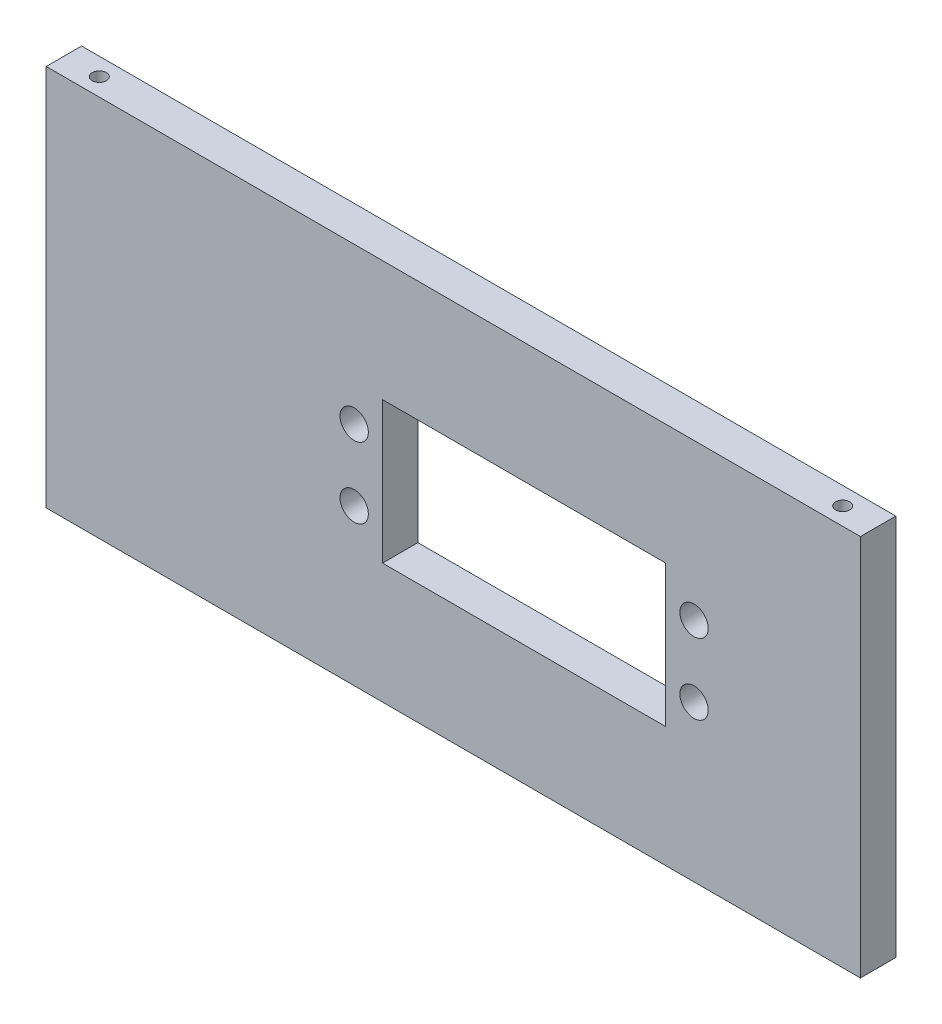
ISO-10303-21;
HEADER;
FILE_DESCRIPTION(('STEP AP214'),'2;1');
FILE_NAME('part.step','',(''),(''),'','','');
FILE_SCHEMA(('AUTOMOTIVE_DESIGN { 1 0 10303 214 1 1 1 1 }'));
ENDSEC;
DATA;
#1=APPLICATION_CONTEXT('core data for automotive mechanical design processes');
#2=APPLICATION_PROTOCOL_DEFINITION('international standard','automotive_design',2000,#1);
#3=PRODUCT_CONTEXT('',#1,'mechanical');
#4=PRODUCT('Part','Part','',(#3));
#5=PRODUCT_RELATED_PRODUCT_CATEGORY('part','',(#4));
#6=PRODUCT_DEFINITION_FORMATION('','',#4);
#7=PRODUCT_DEFINITION_CONTEXT('part definition',#1,'design');
#8=PRODUCT_DEFINITION('design','',#6,#7);
#9=PRODUCT_DEFINITION_SHAPE('','',#8);
#10=(LENGTH_UNIT() NAMED_UNIT(*) SI_UNIT(.MILLI.,.METRE.));
#11=(NAMED_UNIT(*) PLANE_ANGLE_UNIT() SI_UNIT($,.RADIAN.));
#12=(NAMED_UNIT(*) SI_UNIT($,.STERADIAN.) SOLID_ANGLE_UNIT());
#13=UNCERTAINTY_MEASURE_WITH_UNIT(LENGTH_MEASURE(1.E-05),#10,'distance_accuracy_value','');
#14=(GEOMETRIC_REPRESENTATION_CONTEXT(3) GLOBAL_UNCERTAINTY_ASSIGNED_CONTEXT((#13)) GLOBAL_UNIT_ASSIGNED_CONTEXT((#10,
#11,#12)) REPRESENTATION_CONTEXT('',''));
#15=CARTESIAN_POINT('',(0.,0.,0.));
#16=DIRECTION('',(0.,0.,1.));
#17=DIRECTION('',(1.,0.,0.));
#18=AXIS2_PLACEMENT_3D('',#15,#16,#17);
#19=CARTESIAN_POINT('',(0.,0.,5.));
#20=DIRECTION('',(0.,0.,1.));
#21=DIRECTION('',(1.,0.,0.));
#22=AXIS2_PLACEMENT_3D('',#19,#20,#21);
#23=PLANE('',#22);
#24=DIRECTION('',(1.,0.,0.));
#25=VECTOR('',#24,1.);
#26=CARTESIAN_POINT('',(3.06248058403234,-13.4840994339615,5.));
#27=LINE('',#26,#25);
#28=CARTESIAN_POINT('',(3.06248058403234,-13.4840994339615,5.));
#29=VERTEX_POINT('',#28);
#30=CARTESIAN_POINT('',(43.0624805840323,-13.4840994339615,5.));
#31=VERTEX_POINT('',#30);
#32=EDGE_CURVE('E191',#29,#31,#27,.T.);
#33=ORIENTED_EDGE('',*,*,#32,.F.);
#34=DIRECTION('',(0.,-1.,0.));
#35=VECTOR('',#34,1.);
#36=CARTESIAN_POINT('',(3.06248058403234,6.51590056603846,5.));
#37=LINE('',#36,#35);
#38=CARTESIAN_POINT('',(3.06248058403234,6.51590056603846,5.));
#39=VERTEX_POINT('',#38);
#40=EDGE_CURVE('E182',#39,#29,#37,.T.);
#41=ORIENTED_EDGE('',*,*,#40,.F.);
#42=DIRECTION('',(1.,0.,0.));
#43=VECTOR('',#42,1.);
#44=CARTESIAN_POINT('',(3.06248058403234,6.51590056603846,5.));
#45=LINE('',#44,#43);
#46=CARTESIAN_POINT('',(43.0624805840323,6.51590056603846,5.));
#47=VERTEX_POINT('',#46);
#48=EDGE_CURVE('E203',#39,#47,#45,.T.);
#49=ORIENTED_EDGE('',*,*,#48,.T.);
#50=DIRECTION('',(0.,-1.,0.));
#51=VECTOR('',#50,1.);
#52=CARTESIAN_POINT('',(43.0624805840323,6.51590056603846,5.));
#53=LINE('',#52,#51);
#54=EDGE_CURVE('E132',#47,#31,#53,.T.);
#55=ORIENTED_EDGE('',*,*,#54,.T.);
#56=EDGE_LOOP('',(#33,#41,#49,#55));
#57=FACE_BOUND('',#56,.T.);
#58=CARTESIAN_POINT('',(-0.937519415967665,-8.48409943396155,5.));
#59=DIRECTION('',(0.,0.,1.));
#60=DIRECTION('',(1.,0.,0.));
#61=AXIS2_PLACEMENT_3D('',#58,#59,#60);
#62=CIRCLE('',#61,2.);
#63=CARTESIAN_POINT('',(1.06248058403234,-8.48409943396155,5.));
#64=VERTEX_POINT('',#63);
#65=EDGE_CURVE('E220',#64,#64,#62,.T.);
#66=ORIENTED_EDGE('',*,*,#65,.F.);
#67=EDGE_LOOP('',(#66));
#68=FACE_BOUND('',#67,.T.);
#69=CARTESIAN_POINT('',(-0.937519415967661,1.51590056603845,5.));
#70=DIRECTION('',(0.,0.,1.));
#71=DIRECTION('',(1.,0.,0.));
#72=AXIS2_PLACEMENT_3D('',#69,#70,#71);
#73=CIRCLE('',#72,2.);
#74=CARTESIAN_POINT('',(1.06248058403234,1.51590056603845,5.));
#75=VERTEX_POINT('',#74);
#76=EDGE_CURVE('E232',#75,#75,#73,.T.);
#77=ORIENTED_EDGE('',*,*,#76,.F.);
#78=EDGE_LOOP('',(#77));
#79=FACE_BOUND('',#78,.T.);
#80=DIRECTION('',(0.,-1.,0.));
#81=VECTOR('',#80,1.);
#82=CARTESIAN_POINT('',(-44.4375194159677,23.5159005660385,5.));
#83=LINE('',#82,#81);
#84=CARTESIAN_POINT('',(-44.4375194159677,23.5159005660385,5.));
#85=VERTEX_POINT('',#84);
#86=CARTESIAN_POINT('',(-44.4375194159677,-30.4840994339615,5.));
#87=VERTEX_POINT('',#86);
#88=EDGE_CURVE('E238',#85,#87,#83,.T.);
#89=ORIENTED_EDGE('',*,*,#88,.T.);
#90=DIRECTION('',(1.,0.,0.));
#91=VECTOR('',#90,1.);
#92=CARTESIAN_POINT('',(-44.4375194159677,-30.4840994339615,5.));
#93=LINE('',#92,#91);
#94=CARTESIAN_POINT('',(70.5624805840323,-30.4840994339615,5.));
#95=VERTEX_POINT('',#94);
#96=EDGE_CURVE('E241',#87,#95,#93,.T.);
#97=ORIENTED_EDGE('',*,*,#96,.T.);
#98=DIRECTION('',(0.,-1.,0.));
#99=VECTOR('',#98,1.);
#100=CARTESIAN_POINT('',(70.5624805840323,23.5159005660385,5.));
#101=LINE('',#100,#99);
#102=CARTESIAN_POINT('',(70.5624805840323,23.5159005660385,5.));
#103=VERTEX_POINT('',#102);
#104=EDGE_CURVE('E244',#103,#95,#101,.T.);
#105=ORIENTED_EDGE('',*,*,#104,.F.);
#106=DIRECTION('',(1.,0.,0.));
#107=VECTOR('',#106,1.);
#108=CARTESIAN_POINT('',(-44.4375194159677,23.5159005660385,5.));
#109=LINE('',#108,#107);
#110=EDGE_CURVE('E247',#85,#103,#109,.T.);
#111=ORIENTED_EDGE('',*,*,#110,.F.);
#112=EDGE_LOOP('',(#89,#97,#105,#111));
#113=FACE_BOUND('',#112,.T.);
#114=CARTESIAN_POINT('',(47.0624805840323,-8.48409943396155,5.));
#115=DIRECTION('',(0.,0.,1.));
#116=DIRECTION('',(1.,0.,0.));
#117=AXIS2_PLACEMENT_3D('',#114,#115,#116);
#118=CIRCLE('',#117,2.);
#119=CARTESIAN_POINT('',(49.0624805840323,-8.48409943396155,5.));
#120=VERTEX_POINT('',#119);
#121=EDGE_CURVE('E226',#120,#120,#118,.T.);
#122=ORIENTED_EDGE('',*,*,#121,.F.);
#123=EDGE_LOOP('',(#122));
#124=FACE_BOUND('',#123,.T.);
#125=CARTESIAN_POINT('',(47.0624805840323,1.51590056603845,5.));
#126=DIRECTION('',(0.,0.,1.));
#127=DIRECTION('',(1.,0.,0.));
#128=AXIS2_PLACEMENT_3D('',#125,#126,#127);
#129=CIRCLE('',#128,2.);
#130=CARTESIAN_POINT('',(49.0624805840323,1.51590056603845,5.));
#131=VERTEX_POINT('',#130);
#132=EDGE_CURVE('E209',#131,#131,#129,.T.);
#133=ORIENTED_EDGE('',*,*,#132,.F.);
#134=EDGE_LOOP('',(#133));
#135=FACE_BOUND('',#134,.T.);
#136=ADVANCED_FACE('F117',(#57,#68,#79,#113,#124,#135),#23,.T.);
#137=CARTESIAN_POINT('',(0.,0.,0.));
#138=DIRECTION('',(0.,0.,1.));
#139=DIRECTION('',(1.,0.,0.));
#140=AXIS2_PLACEMENT_3D('',#137,#138,#139);
#141=PLANE('',#140);
#142=CARTESIAN_POINT('',(-0.937519415967665,-8.48409943396155,0.));
#143=DIRECTION('',(0.,0.,1.));
#144=DIRECTION('',(1.,0.,0.));
#145=AXIS2_PLACEMENT_3D('',#142,#143,#144);
#146=CIRCLE('',#145,2.);
#147=CARTESIAN_POINT('',(1.06248058403234,-8.48409943396155,0.));
#148=VERTEX_POINT('',#147);
#149=EDGE_CURVE('E198',#148,#148,#146,.T.);
#150=ORIENTED_EDGE('',*,*,#149,.T.);
#151=EDGE_LOOP('',(#150));
#152=FACE_BOUND('',#151,.T.);
#153=CARTESIAN_POINT('',(47.0624805840323,-8.48409943396155,0.));
#154=DIRECTION('',(0.,0.,1.));
#155=DIRECTION('',(1.,0.,0.));
#156=AXIS2_PLACEMENT_3D('',#153,#154,#155);
#157=CIRCLE('',#156,2.);
#158=CARTESIAN_POINT('',(49.0624805840323,-8.48409943396155,0.));
#159=VERTEX_POINT('',#158);
#160=EDGE_CURVE('E223',#159,#159,#157,.T.);
#161=ORIENTED_EDGE('',*,*,#160,.T.);
#162=EDGE_LOOP('',(#161));
#163=FACE_BOUND('',#162,.T.);
#164=CARTESIAN_POINT('',(-0.937519415967661,1.51590056603845,0.));
#165=DIRECTION('',(0.,0.,1.));
#166=DIRECTION('',(1.,0.,0.));
#167=AXIS2_PLACEMENT_3D('',#164,#165,#166);
#168=CIRCLE('',#167,2.);
#169=CARTESIAN_POINT('',(1.06248058403234,1.51590056603845,0.));
#170=VERTEX_POINT('',#169);
#171=EDGE_CURVE('E229',#170,#170,#168,.T.);
#172=ORIENTED_EDGE('',*,*,#171,.T.);
#173=EDGE_LOOP('',(#172));
#174=FACE_BOUND('',#173,.T.);
#175=DIRECTION('',(0.,-1.,0.));
#176=VECTOR('',#175,1.);
#177=CARTESIAN_POINT('',(-44.4375194159677,23.5159005660385,0.));
#178=LINE('',#177,#176);
#179=CARTESIAN_POINT('',(-44.4375194159677,23.5159005660385,0.));
#180=VERTEX_POINT('',#179);
#181=CARTESIAN_POINT('',(-44.4375194159677,-30.4840994339615,0.));
#182=VERTEX_POINT('',#181);
#183=EDGE_CURVE('E235',#180,#182,#178,.T.);
#184=ORIENTED_EDGE('',*,*,#183,.F.);
#185=DIRECTION('',(1.,0.,0.));
#186=VECTOR('',#185,1.);
#187=CARTESIAN_POINT('',(-44.4375194159677,23.5159005660385,0.));
#188=LINE('',#187,#186);
#189=CARTESIAN_POINT('',(70.5624805840323,23.5159005660385,0.));
#190=VERTEX_POINT('',#189);
#191=EDGE_CURVE('E242',#180,#190,#188,.T.);
#192=ORIENTED_EDGE('',*,*,#191,.T.);
#193=DIRECTION('',(0.,-1.,0.));
#194=VECTOR('',#193,1.);
#195=CARTESIAN_POINT('',(70.5624805840323,23.5159005660385,0.));
#196=LINE('',#195,#194);
#197=CARTESIAN_POINT('',(70.5624805840323,-30.4840994339615,0.));
#198=VERTEX_POINT('',#197);
#199=EDGE_CURVE('E256',#190,#198,#196,.T.);
#200=ORIENTED_EDGE('',*,*,#199,.T.);
#201=DIRECTION('',(1.,0.,0.));
#202=VECTOR('',#201,1.);
#203=CARTESIAN_POINT('',(-44.4375194159677,-30.4840994339615,0.));
#204=LINE('',#203,#202);
#205=EDGE_CURVE('E253',#182,#198,#204,.T.);
#206=ORIENTED_EDGE('',*,*,#205,.F.);
#207=EDGE_LOOP('',(#184,#192,#200,#206));
#208=FACE_BOUND('',#207,.T.);
#209=DIRECTION('',(0.,-1.,0.));
#210=VECTOR('',#209,1.);
#211=CARTESIAN_POINT('',(3.06248058403234,6.51590056603846,0.));
#212=LINE('',#211,#210);
#213=CARTESIAN_POINT('',(3.06248058403234,6.51590056603846,0.));
#214=VERTEX_POINT('',#213);
#215=CARTESIAN_POINT('',(3.06248058403234,-13.4840994339615,0.));
#216=VERTEX_POINT('',#215);
#217=EDGE_CURVE('E140',#214,#216,#212,.T.);
#218=ORIENTED_EDGE('',*,*,#217,.T.);
#219=DIRECTION('',(1.,0.,0.));
#220=VECTOR('',#219,1.);
#221=CARTESIAN_POINT('',(3.06248058403234,-13.4840994339615,0.));
#222=LINE('',#221,#220);
#223=CARTESIAN_POINT('',(43.0624805840323,-13.4840994339615,0.));
#224=VERTEX_POINT('',#223);
#225=EDGE_CURVE('E197',#216,#224,#222,.T.);
#226=ORIENTED_EDGE('',*,*,#225,.T.);
#227=DIRECTION('',(0.,-1.,0.));
#228=VECTOR('',#227,1.);
#229=CARTESIAN_POINT('',(43.0624805840323,6.51590056603846,0.));
#230=LINE('',#229,#228);
#231=CARTESIAN_POINT('',(43.0624805840323,6.51590056603846,0.));
#232=VERTEX_POINT('',#231);
#233=EDGE_CURVE('E211',#232,#224,#230,.T.);
#234=ORIENTED_EDGE('',*,*,#233,.F.);
#235=DIRECTION('',(1.,0.,0.));
#236=VECTOR('',#235,1.);
#237=CARTESIAN_POINT('',(3.06248058403234,6.51590056603846,0.));
#238=LINE('',#237,#236);
#239=EDGE_CURVE('E192',#214,#232,#238,.T.);
#240=ORIENTED_EDGE('',*,*,#239,.F.);
#241=EDGE_LOOP('',(#218,#226,#234,#240));
#242=FACE_BOUND('',#241,.T.);
#243=CARTESIAN_POINT('',(47.0624805840323,1.51590056603845,0.));
#244=DIRECTION('',(0.,0.,1.));
#245=DIRECTION('',(1.,0.,0.));
#246=AXIS2_PLACEMENT_3D('',#243,#244,#245);
#247=CIRCLE('',#246,2.);
#248=CARTESIAN_POINT('',(49.0624805840323,1.51590056603845,0.));
#249=VERTEX_POINT('',#248);
#250=EDGE_CURVE('E507',#249,#249,#247,.T.);
#251=ORIENTED_EDGE('',*,*,#250,.T.);
#252=EDGE_LOOP('',(#251));
#253=FACE_BOUND('',#252,.T.);
#254=ADVANCED_FACE('F273',(#152,#163,#174,#208,#242,#253),#141,.F.);
#255=CARTESIAN_POINT('',(-44.4375194159677,23.5159005660385,5.));
#256=DIRECTION('',(1.,0.,0.));
#257=DIRECTION('',(0.,1.,0.));
#258=AXIS2_PLACEMENT_3D('',#255,#256,#257);
#259=PLANE('',#258);
#260=ORIENTED_EDGE('',*,*,#183,.T.);
#261=DIRECTION('',(0.,0.,-1.));
#262=VECTOR('',#261,1.);
#263=CARTESIAN_POINT('',(-44.4375194159677,-30.4840994339615,5.));
#264=LINE('',#263,#262);
#265=EDGE_CURVE('E12',#87,#182,#264,.T.);
#266=ORIENTED_EDGE('',*,*,#265,.F.);
#267=ORIENTED_EDGE('',*,*,#88,.F.);
#268=DIRECTION('',(0.,0.,-1.));
#269=VECTOR('',#268,1.);
#270=CARTESIAN_POINT('',(-44.4375194159677,23.5159005660385,5.));
#271=LINE('',#270,#269);
#272=EDGE_CURVE('E250',#85,#180,#271,.T.);
#273=ORIENTED_EDGE('',*,*,#272,.T.);
#274=EDGE_LOOP('',(#260,#266,#267,#273));
#275=FACE_BOUND('',#274,.T.);
#276=ADVANCED_FACE('F119',(#275),#259,.F.);
#277=CARTESIAN_POINT('',(-44.4375194159677,-30.4840994339615,5.));
#278=DIRECTION('',(0.,1.,0.));
#279=DIRECTION('',(0.,0.,1.));
#280=AXIS2_PLACEMENT_3D('',#277,#278,#279);
#281=PLANE('',#280);
#282=CARTESIAN_POINT('',(-2.93751941596766,-30.4840994339615,2.5));
#283=DIRECTION('',(0.,-1.,0.));
#284=DIRECTION('',(0.,0.,-1.));
#285=AXIS2_PLACEMENT_3D('',#282,#283,#284);
#286=CIRCLE('',#285,1.75);
#287=CARTESIAN_POINT('',(-2.93751941596766,-30.4840994339615,0.749999999999996));
#288=VERTEX_POINT('',#287);
#289=EDGE_CURVE('E490',#288,#288,#286,.T.);
#290=ORIENTED_EDGE('',*,*,#289,.F.);
#291=EDGE_LOOP('',(#290));
#292=FACE_BOUND('',#291,.T.);
#293=CARTESIAN_POINT('',(29.0624805840323,-30.4840994339615,2.5));
#294=DIRECTION('',(0.,-1.,0.));
#295=DIRECTION('',(0.,0.,-1.));
#296=AXIS2_PLACEMENT_3D('',#293,#294,#295);
#297=CIRCLE('',#296,1.75);
#298=CARTESIAN_POINT('',(29.0624805840323,-30.4840994339615,0.749999999999996));
#299=VERTEX_POINT('',#298);
#300=EDGE_CURVE('E496',#299,#299,#297,.T.);
#301=ORIENTED_EDGE('',*,*,#300,.F.);
#302=EDGE_LOOP('',(#301));
#303=FACE_BOUND('',#302,.T.);
#304=ORIENTED_EDGE('',*,*,#205,.T.);
#305=DIRECTION('',(0.,0.,-1.));
#306=VECTOR('',#305,1.);
#307=CARTESIAN_POINT('',(70.5624805840323,-30.4840994339615,5.));
#308=LINE('',#307,#306);
#309=EDGE_CURVE('E125',#95,#198,#308,.T.);
#310=ORIENTED_EDGE('',*,*,#309,.F.);
#311=ORIENTED_EDGE('',*,*,#96,.F.);
#312=ORIENTED_EDGE('',*,*,#265,.T.);
#313=EDGE_LOOP('',(#304,#310,#311,#312));
#314=FACE_BOUND('',#313,.T.);
#315=ADVANCED_FACE('F269',(#292,#303,#314),#281,.F.);
#316=CARTESIAN_POINT('',(70.5624805840323,23.5159005660385,5.));
#317=DIRECTION('',(1.,0.,0.));
#318=DIRECTION('',(0.,0.,-1.));
#319=AXIS2_PLACEMENT_3D('',#316,#317,#318);
#320=PLANE('',#319);
#321=ORIENTED_EDGE('',*,*,#199,.F.);
#322=DIRECTION('',(0.,0.,-1.));
#323=VECTOR('',#322,1.);
#324=CARTESIAN_POINT('',(70.5624805840323,23.5159005660385,5.));
#325=LINE('',#324,#323);
#326=EDGE_CURVE('E262',#103,#190,#325,.T.);
#327=ORIENTED_EDGE('',*,*,#326,.F.);
#328=ORIENTED_EDGE('',*,*,#104,.T.);
#329=ORIENTED_EDGE('',*,*,#309,.T.);
#330=EDGE_LOOP('',(#321,#327,#328,#329));
#331=FACE_BOUND('',#330,.T.);
#332=ADVANCED_FACE('F266',(#331),#320,.T.);
#333=CARTESIAN_POINT('',(-44.4375194159677,23.5159005660385,5.));
#334=DIRECTION('',(0.,1.,0.));
#335=DIRECTION('',(0.,0.,1.));
#336=AXIS2_PLACEMENT_3D('',#333,#334,#335);
#337=PLANE('',#336);
#338=CARTESIAN_POINT('',(-39.4375194159677,23.5159005660385,2.5));
#339=DIRECTION('',(0.,1.,0.));
#340=DIRECTION('',(0.,0.,1.));
#341=AXIS2_PLACEMENT_3D('',#338,#339,#340);
#342=CIRCLE('',#341,0.999999999999998);
#343=CARTESIAN_POINT('',(-39.4375194159677,23.5159005660385,3.5));
#344=VERTEX_POINT('',#343);
#345=EDGE_CURVE('E508',#344,#344,#342,.T.);
#346=ORIENTED_EDGE('',*,*,#345,.F.);
#347=EDGE_LOOP('',(#346));
#348=FACE_BOUND('',#347,.T.);
#349=CARTESIAN_POINT('',(65.5624805840323,23.5159005660385,2.5));
#350=DIRECTION('',(0.,1.,0.));
#351=DIRECTION('',(0.,0.,1.));
#352=AXIS2_PLACEMENT_3D('',#349,#350,#351);
#353=CIRCLE('',#352,0.999999999999998);
#354=CARTESIAN_POINT('',(65.5624805840323,23.5159005660385,3.5));
#355=VERTEX_POINT('',#354);
#356=EDGE_CURVE('E493',#355,#355,#353,.T.);
#357=ORIENTED_EDGE('',*,*,#356,.F.);
#358=EDGE_LOOP('',(#357));
#359=FACE_BOUND('',#358,.T.);
#360=ORIENTED_EDGE('',*,*,#191,.F.);
#361=ORIENTED_EDGE('',*,*,#272,.F.);
#362=ORIENTED_EDGE('',*,*,#110,.T.);
#363=ORIENTED_EDGE('',*,*,#326,.T.);
#364=EDGE_LOOP('',(#360,#361,#362,#363));
#365=FACE_BOUND('',#364,.T.);
#366=ADVANCED_FACE('F277',(#348,#359,#365),#337,.T.);
#367=CARTESIAN_POINT('',(-0.937519415967661,1.51590056603845,5.));
#368=DIRECTION('',(0.,0.,-1.));
#369=DIRECTION('',(-1.,0.,0.));
#370=AXIS2_PLACEMENT_3D('',#367,#368,#369);
#371=CYLINDRICAL_SURFACE('',#370,2.);
#372=ORIENTED_EDGE('',*,*,#76,.T.);
#373=EDGE_LOOP('',(#372));
#374=FACE_BOUND('',#373,.T.);
#375=ORIENTED_EDGE('',*,*,#171,.F.);
#376=EDGE_LOOP('',(#375));
#377=FACE_BOUND('',#376,.T.);
#378=ADVANCED_FACE('F297',(#374,#377),#371,.F.);
#379=CARTESIAN_POINT('',(47.0624805840323,-8.48409943396155,5.));
#380=DIRECTION('',(0.,0.,-1.));
#381=DIRECTION('',(-1.,0.,0.));
#382=AXIS2_PLACEMENT_3D('',#379,#380,#381);
#383=CYLINDRICAL_SURFACE('',#382,2.);
#384=ORIENTED_EDGE('',*,*,#121,.T.);
#385=EDGE_LOOP('',(#384));
#386=FACE_BOUND('',#385,.T.);
#387=ORIENTED_EDGE('',*,*,#160,.F.);
#388=EDGE_LOOP('',(#387));
#389=FACE_BOUND('',#388,.T.);
#390=ADVANCED_FACE('F320',(#386,#389),#383,.F.);
#391=CARTESIAN_POINT('',(-0.937519415967665,-8.48409943396155,5.));
#392=DIRECTION('',(0.,0.,-1.));
#393=DIRECTION('',(-1.,0.,0.));
#394=AXIS2_PLACEMENT_3D('',#391,#392,#393);
#395=CYLINDRICAL_SURFACE('',#394,2.);
#396=ORIENTED_EDGE('',*,*,#65,.T.);
#397=EDGE_LOOP('',(#396));
#398=FACE_BOUND('',#397,.T.);
#399=ORIENTED_EDGE('',*,*,#149,.F.);
#400=EDGE_LOOP('',(#399));
#401=FACE_BOUND('',#400,.T.);
#402=ADVANCED_FACE('F327',(#398,#401),#395,.F.);
#403=CARTESIAN_POINT('',(3.06248058403234,6.51590056603846,5.));
#404=DIRECTION('',(1.,0.,0.));
#405=DIRECTION('',(0.,0.,-1.));
#406=AXIS2_PLACEMENT_3D('',#403,#404,#405);
#407=PLANE('',#406);
#408=ORIENTED_EDGE('',*,*,#217,.F.);
#409=DIRECTION('',(0.,0.,-1.));
#410=VECTOR('',#409,1.);
#411=CARTESIAN_POINT('',(3.06248058403234,6.51590056603846,5.));
#412=LINE('',#411,#410);
#413=EDGE_CURVE('E186',#39,#214,#412,.T.);
#414=ORIENTED_EDGE('',*,*,#413,.F.);
#415=ORIENTED_EDGE('',*,*,#40,.T.);
#416=DIRECTION('',(0.,0.,-1.));
#417=VECTOR('',#416,1.);
#418=CARTESIAN_POINT('',(3.06248058403234,-13.4840994339615,5.));
#419=LINE('',#418,#417);
#420=EDGE_CURVE('E185',#29,#216,#419,.T.);
#421=ORIENTED_EDGE('',*,*,#420,.T.);
#422=EDGE_LOOP('',(#408,#414,#415,#421));
#423=FACE_BOUND('',#422,.T.);
#424=ADVANCED_FACE('F184',(#423),#407,.T.);
#425=CARTESIAN_POINT('',(3.06248058403234,-13.4840994339615,5.));
#426=DIRECTION('',(0.,1.,0.));
#427=DIRECTION('',(-1.,0.,0.));
#428=AXIS2_PLACEMENT_3D('',#425,#426,#427);
#429=PLANE('',#428);
#430=ORIENTED_EDGE('',*,*,#225,.F.);
#431=ORIENTED_EDGE('',*,*,#420,.F.);
#432=ORIENTED_EDGE('',*,*,#32,.T.);
#433=DIRECTION('',(0.,0.,-1.));
#434=VECTOR('',#433,1.);
#435=CARTESIAN_POINT('',(43.0624805840323,-13.4840994339615,5.));
#436=LINE('',#435,#434);
#437=EDGE_CURVE('E199',#31,#224,#436,.T.);
#438=ORIENTED_EDGE('',*,*,#437,.T.);
#439=EDGE_LOOP('',(#430,#431,#432,#438));
#440=FACE_BOUND('',#439,.T.);
#441=ADVANCED_FACE('F195',(#440),#429,.T.);
#442=CARTESIAN_POINT('',(43.0624805840323,6.51590056603846,5.));
#443=DIRECTION('',(1.,0.,0.));
#444=DIRECTION('',(0.,0.,-1.));
#445=AXIS2_PLACEMENT_3D('',#442,#443,#444);
#446=PLANE('',#445);
#447=ORIENTED_EDGE('',*,*,#233,.T.);
#448=ORIENTED_EDGE('',*,*,#437,.F.);
#449=ORIENTED_EDGE('',*,*,#54,.F.);
#450=DIRECTION('',(0.,0.,-1.));
#451=VECTOR('',#450,1.);
#452=CARTESIAN_POINT('',(43.0624805840323,6.51590056603846,5.));
#453=LINE('',#452,#451);
#454=EDGE_CURVE('E217',#47,#232,#453,.T.);
#455=ORIENTED_EDGE('',*,*,#454,.T.);
#456=EDGE_LOOP('',(#447,#448,#449,#455));
#457=FACE_BOUND('',#456,.T.);
#458=ADVANCED_FACE('F347',(#457),#446,.F.);
#459=CARTESIAN_POINT('',(3.06248058403234,6.51590056603846,5.));
#460=DIRECTION('',(0.,1.,0.));
#461=DIRECTION('',(0.,0.,1.));
#462=AXIS2_PLACEMENT_3D('',#459,#460,#461);
#463=PLANE('',#462);
#464=ORIENTED_EDGE('',*,*,#239,.T.);
#465=ORIENTED_EDGE('',*,*,#454,.F.);
#466=ORIENTED_EDGE('',*,*,#48,.F.);
#467=ORIENTED_EDGE('',*,*,#413,.T.);
#468=EDGE_LOOP('',(#464,#465,#466,#467));
#469=FACE_BOUND('',#468,.T.);
#470=ADVANCED_FACE('F354',(#469),#463,.F.);
#471=CARTESIAN_POINT('',(47.0624805840323,1.51590056603845,5.));
#472=DIRECTION('',(0.,0.,-1.));
#473=DIRECTION('',(-1.,0.,0.));
#474=AXIS2_PLACEMENT_3D('',#471,#472,#473);
#475=CYLINDRICAL_SURFACE('',#474,2.);
#476=ORIENTED_EDGE('',*,*,#132,.T.);
#477=EDGE_LOOP('',(#476));
#478=FACE_BOUND('',#477,.T.);
#479=ORIENTED_EDGE('',*,*,#250,.F.);
#480=EDGE_LOOP('',(#479));
#481=FACE_BOUND('',#480,.T.);
#482=ADVANCED_FACE('F361',(#478,#481),#475,.F.);
#483=CARTESIAN_POINT('',(65.5624805840323,8.51590056603845,2.5));
#484=DIRECTION('',(0.,1.,0.));
#485=DIRECTION('',(0.,0.,1.));
#486=AXIS2_PLACEMENT_3D('',#483,#484,#485);
#487=CYLINDRICAL_SURFACE('',#486,0.999999999999998);
#488=CARTESIAN_POINT('',(65.5624805840323,8.51590056603845,2.5));
#489=DIRECTION('',(0.,1.,0.));
#490=DIRECTION('',(0.,0.,1.));
#491=AXIS2_PLACEMENT_3D('',#488,#489,#490);
#492=CIRCLE('',#491,0.999999999999998);
#493=CARTESIAN_POINT('',(65.5624805840323,8.51590056603845,3.5));
#494=VERTEX_POINT('',#493);
#495=EDGE_CURVE('E489',#494,#494,#492,.T.);
#496=ORIENTED_EDGE('',*,*,#495,.F.);
#497=EDGE_LOOP('',(#496));
#498=FACE_BOUND('',#497,.T.);
#499=ORIENTED_EDGE('',*,*,#356,.T.);
#500=EDGE_LOOP('',(#499));
#501=FACE_BOUND('',#500,.T.);
#502=ADVANCED_FACE('F368',(#498,#501),#487,.F.);
#503=CARTESIAN_POINT('',(65.5624805840323,8.51590056603845,2.5));
#504=DIRECTION('',(0.,1.,0.));
#505=DIRECTION('',(0.,0.,1.));
#506=AXIS2_PLACEMENT_3D('',#503,#504,#505);
#507=PLANE('',#506);
#508=ORIENTED_EDGE('',*,*,#495,.T.);
#509=EDGE_LOOP('',(#508));
#510=FACE_BOUND('',#509,.T.);
#511=ADVANCED_FACE('F375',(#510),#507,.T.);
#512=CARTESIAN_POINT('',(-39.4375194159677,8.51590056603845,2.5));
#513=DIRECTION('',(0.,1.,0.));
#514=DIRECTION('',(0.,0.,1.));
#515=AXIS2_PLACEMENT_3D('',#512,#513,#514);
#516=CYLINDRICAL_SURFACE('',#515,0.999999999999998);
#517=CARTESIAN_POINT('',(-39.4375194159677,8.51590056603845,2.5));
#518=DIRECTION('',(0.,1.,0.));
#519=DIRECTION('',(0.,0.,1.));
#520=AXIS2_PLACEMENT_3D('',#517,#518,#519);
#521=CIRCLE('',#520,0.999999999999998);
#522=CARTESIAN_POINT('',(-39.4375194159677,8.51590056603845,3.5));
#523=VERTEX_POINT('',#522);
#524=EDGE_CURVE('E504',#523,#523,#521,.T.);
#525=ORIENTED_EDGE('',*,*,#524,.F.);
#526=EDGE_LOOP('',(#525));
#527=FACE_BOUND('',#526,.T.);
#528=ORIENTED_EDGE('',*,*,#345,.T.);
#529=EDGE_LOOP('',(#528));
#530=FACE_BOUND('',#529,.T.);
#531=ADVANCED_FACE('F383',(#527,#530),#516,.F.);
#532=CARTESIAN_POINT('',(-39.4375194159677,8.51590056603845,2.5));
#533=DIRECTION('',(0.,1.,0.));
#534=DIRECTION('',(0.,0.,1.));
#535=AXIS2_PLACEMENT_3D('',#532,#533,#534);
#536=PLANE('',#535);
#537=ORIENTED_EDGE('',*,*,#524,.T.);
#538=EDGE_LOOP('',(#537));
#539=FACE_BOUND('',#538,.T.);
#540=ADVANCED_FACE('F391',(#539),#536,.T.);
#541=CARTESIAN_POINT('',(29.0624805840323,-15.4840994339615,2.5));
#542=DIRECTION('',(0.,-1.,0.));
#543=DIRECTION('',(0.,0.,-1.));
#544=AXIS2_PLACEMENT_3D('',#541,#542,#543);
#545=CYLINDRICAL_SURFACE('',#544,1.75);
#546=CARTESIAN_POINT('',(29.0624805840323,-15.4840994339615,2.5));
#547=DIRECTION('',(0.,-1.,0.));
#548=DIRECTION('',(0.,0.,-1.));
#549=AXIS2_PLACEMENT_3D('',#546,#547,#548);
#550=CIRCLE('',#549,1.75);
#551=CARTESIAN_POINT('',(29.0624805840323,-15.4840994339615,0.749999999999996));
#552=VERTEX_POINT('',#551);
#553=EDGE_CURVE('E501',#552,#552,#550,.T.);
#554=ORIENTED_EDGE('',*,*,#553,.F.);
#555=EDGE_LOOP('',(#554));
#556=FACE_BOUND('',#555,.T.);
#557=ORIENTED_EDGE('',*,*,#300,.T.);
#558=EDGE_LOOP('',(#557));
#559=FACE_BOUND('',#558,.T.);
#560=ADVANCED_FACE('F399',(#556,#559),#545,.F.);
#561=CARTESIAN_POINT('',(29.0624805840323,-15.4840994339615,2.5));
#562=DIRECTION('',(0.,-1.,0.));
#563=DIRECTION('',(0.,0.,-1.));
#564=AXIS2_PLACEMENT_3D('',#561,#562,#563);
#565=PLANE('',#564);
#566=ORIENTED_EDGE('',*,*,#553,.T.);
#567=EDGE_LOOP('',(#566));
#568=FACE_BOUND('',#567,.T.);
#569=ADVANCED_FACE('F407',(#568),#565,.T.);
#570=CARTESIAN_POINT('',(-2.93751941596766,-15.4840994339615,2.5));
#571=DIRECTION('',(0.,-1.,0.));
#572=DIRECTION('',(0.,0.,-1.));
#573=AXIS2_PLACEMENT_3D('',#570,#571,#572);
#574=CYLINDRICAL_SURFACE('',#573,1.75);
#575=CARTESIAN_POINT('',(-2.93751941596766,-15.4840994339615,2.5));
#576=DIRECTION('',(0.,-1.,0.));
#577=DIRECTION('',(0.,0.,-1.));
#578=AXIS2_PLACEMENT_3D('',#575,#576,#577);
#579=CIRCLE('',#578,1.75);
#580=CARTESIAN_POINT('',(-2.93751941596766,-15.4840994339615,0.749999999999996));
#581=VERTEX_POINT('',#580);
#582=EDGE_CURVE('E488',#581,#581,#579,.T.);
#583=ORIENTED_EDGE('',*,*,#582,.F.);
#584=EDGE_LOOP('',(#583));
#585=FACE_BOUND('',#584,.T.);
#586=ORIENTED_EDGE('',*,*,#289,.T.);
#587=EDGE_LOOP('',(#586));
#588=FACE_BOUND('',#587,.T.);
#589=ADVANCED_FACE('F415',(#585,#588),#574,.F.);
#590=CARTESIAN_POINT('',(-2.93751941596766,-15.4840994339615,2.5));
#591=DIRECTION('',(0.,-1.,0.));
#592=DIRECTION('',(0.,0.,-1.));
#593=AXIS2_PLACEMENT_3D('',#590,#591,#592);
#594=PLANE('',#593);
#595=ORIENTED_EDGE('',*,*,#582,.T.);
#596=EDGE_LOOP('',(#595));
#597=FACE_BOUND('',#596,.T.);
#598=ADVANCED_FACE('F423',(#597),#594,.T.);
#599=CLOSED_SHELL('',(#136,#254,#276,#315,#332,#366,#378,#390,#402,#424,#441,#458,#470,#482,
#502,#511,#531,#540,#560,#569,#589,#598));
#600=MANIFOLD_SOLID_BREP('B2',#599);
#601=ADVANCED_BREP_SHAPE_REPRESENTATION('',(#18,#600),#14);
#602=SHAPE_DEFINITION_REPRESENTATION(#9,#601);
ENDSEC;
END-ISO-10303-21;
